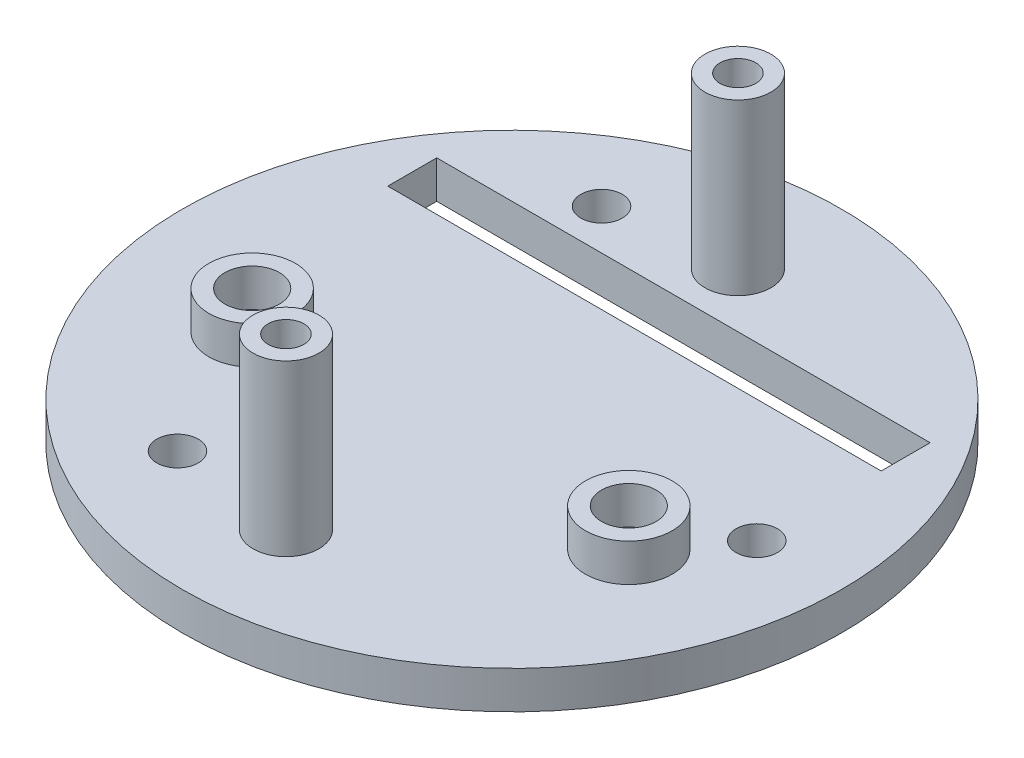
ISO-10303-21;
HEADER;
FILE_DESCRIPTION(('STEP AP214'),'2;1');
FILE_NAME('part.step','',(''),(''),'','','');
FILE_SCHEMA(('AUTOMOTIVE_DESIGN { 1 0 10303 214 1 1 1 1 }'));
ENDSEC;
DATA;
#1=APPLICATION_CONTEXT('core data for automotive mechanical design processes');
#2=APPLICATION_PROTOCOL_DEFINITION('international standard','automotive_design',2000,#1);
#3=PRODUCT_CONTEXT('',#1,'mechanical');
#4=PRODUCT('Part','Part','',(#3));
#5=PRODUCT_RELATED_PRODUCT_CATEGORY('part','',(#4));
#6=PRODUCT_DEFINITION_FORMATION('','',#4);
#7=PRODUCT_DEFINITION_CONTEXT('part definition',#1,'design');
#8=PRODUCT_DEFINITION('design','',#6,#7);
#9=PRODUCT_DEFINITION_SHAPE('','',#8);
#10=(LENGTH_UNIT() NAMED_UNIT(*) SI_UNIT(.MILLI.,.METRE.));
#11=(NAMED_UNIT(*) PLANE_ANGLE_UNIT() SI_UNIT($,.RADIAN.));
#12=(NAMED_UNIT(*) SI_UNIT($,.STERADIAN.) SOLID_ANGLE_UNIT());
#13=UNCERTAINTY_MEASURE_WITH_UNIT(LENGTH_MEASURE(1.E-05),#10,'distance_accuracy_value','');
#14=(GEOMETRIC_REPRESENTATION_CONTEXT(3) GLOBAL_UNCERTAINTY_ASSIGNED_CONTEXT((#13)) GLOBAL_UNIT_ASSIGNED_CONTEXT((#10,
#11,#12)) REPRESENTATION_CONTEXT('',''));
#15=CARTESIAN_POINT('',(0.,0.,0.));
#16=DIRECTION('',(0.,0.,1.));
#17=DIRECTION('',(1.,0.,0.));
#18=AXIS2_PLACEMENT_3D('',#15,#16,#17);
#19=CARTESIAN_POINT('',(-4.53168276531319E-07,2.,7.65631873007925E-07));
#20=DIRECTION('',(0.,1.,0.));
#21=DIRECTION('',(0.,0.,1.));
#22=AXIS2_PLACEMENT_3D('',#19,#20,#21);
#23=PLANE('',#22);
#24=CARTESIAN_POINT('',(0.,2.,-12.));
#25=DIRECTION('',(0.,1.,0.));
#26=DIRECTION('',(0.,0.,1.));
#27=AXIS2_PLACEMENT_3D('',#24,#25,#26);
#28=CIRCLE('',#27,1.75);
#29=CARTESIAN_POINT('',(0.,2.,-10.25));
#30=VERTEX_POINT('',#29);
#31=EDGE_CURVE('E174',#30,#30,#28,.F.);
#32=ORIENTED_EDGE('',*,*,#31,.T.);
#33=EDGE_LOOP('',(#32));
#34=FACE_BOUND('',#33,.T.);
#35=CARTESIAN_POINT('',(0.00199999999988129,2.,12.));
#36=DIRECTION('',(0.,1.,0.));
#37=DIRECTION('',(0.,0.,1.));
#38=AXIS2_PLACEMENT_3D('',#35,#36,#37);
#39=CIRCLE('',#38,1.75);
#40=CARTESIAN_POINT('',(0.00199999999988129,2.,13.75));
#41=VERTEX_POINT('',#40);
#42=EDGE_CURVE('E181',#41,#41,#39,.F.);
#43=ORIENTED_EDGE('',*,*,#42,.T.);
#44=EDGE_LOOP('',(#43));
#45=FACE_BOUND('',#44,.T.);
#46=CARTESIAN_POINT('',(-10.,2.,3.79325587671265));
#47=DIRECTION('',(0.,1.,0.));
#48=DIRECTION('',(0.,0.,1.));
#49=AXIS2_PLACEMENT_3D('',#46,#47,#48);
#50=CIRCLE('',#49,2.3);
#51=CARTESIAN_POINT('',(-10.,2.,6.09325587671264));
#52=VERTEX_POINT('',#51);
#53=EDGE_CURVE('E148',#52,#52,#50,.F.);
#54=ORIENTED_EDGE('',*,*,#53,.T.);
#55=EDGE_LOOP('',(#54));
#56=FACE_BOUND('',#55,.T.);
#57=CARTESIAN_POINT('',(10.,2.,3.79325587671264));
#58=DIRECTION('',(0.,1.,0.));
#59=DIRECTION('',(0.,0.,1.));
#60=AXIS2_PLACEMENT_3D('',#57,#58,#59);
#61=CIRCLE('',#60,2.3);
#62=CARTESIAN_POINT('',(10.,2.,6.09325587671264));
#63=VERTEX_POINT('',#62);
#64=EDGE_CURVE('E163',#63,#63,#61,.F.);
#65=ORIENTED_EDGE('',*,*,#64,.T.);
#66=EDGE_LOOP('',(#65));
#67=FACE_BOUND('',#66,.T.);
#68=CARTESIAN_POINT('',(13.,2.,-7.65631873005101E-07));
#69=DIRECTION('',(0.,1.,0.));
#70=DIRECTION('',(0.,0.,1.));
#71=AXIS2_PLACEMENT_3D('',#68,#69,#70);
#72=CIRCLE('',#71,1.1);
#73=CARTESIAN_POINT('',(13.,2.,1.09999923436813));
#74=VERTEX_POINT('',#73);
#75=EDGE_CURVE('E142',#74,#74,#72,.T.);
#76=ORIENTED_EDGE('',*,*,#75,.F.);
#77=EDGE_LOOP('',(#76));
#78=FACE_BOUND('',#77,.T.);
#79=DIRECTION('',(1.,0.,0.));
#80=VECTOR('',#79,1.);
#81=CARTESIAN_POINT('',(0.,2.,-6.50674412328736));
#82=LINE('',#81,#80);
#83=CARTESIAN_POINT('',(-13.1000004531683,2.,-6.50674412328736));
#84=VERTEX_POINT('',#83);
#85=CARTESIAN_POINT('',(13.0999995468317,2.,-6.50674412328736));
#86=VERTEX_POINT('',#85);
#87=EDGE_CURVE('E99',#84,#86,#82,.T.);
#88=ORIENTED_EDGE('',*,*,#87,.F.);
#89=DIRECTION('',(0.,0.,1.));
#90=VECTOR('',#89,1.);
#91=CARTESIAN_POINT('',(-13.1000004531683,2.,0.));
#92=LINE('',#91,#90);
#93=CARTESIAN_POINT('',(-13.1000004531683,2.,-9.10674412328736));
#94=VERTEX_POINT('',#93);
#95=EDGE_CURVE('E93',#94,#84,#92,.T.);
#96=ORIENTED_EDGE('',*,*,#95,.F.);
#97=DIRECTION('',(1.,0.,0.));
#98=VECTOR('',#97,1.);
#99=CARTESIAN_POINT('',(0.,2.,-9.10674412328736));
#100=LINE('',#99,#98);
#101=CARTESIAN_POINT('',(13.0999995468317,2.,-9.10674412328736));
#102=VERTEX_POINT('',#101);
#103=EDGE_CURVE('E83',#94,#102,#100,.T.);
#104=ORIENTED_EDGE('',*,*,#103,.T.);
#105=DIRECTION('',(0.,0.,-1.));
#106=VECTOR('',#105,1.);
#107=CARTESIAN_POINT('',(13.0999995468317,2.,0.));
#108=LINE('',#107,#106);
#109=EDGE_CURVE('E103',#86,#102,#108,.T.);
#110=ORIENTED_EDGE('',*,*,#109,.F.);
#111=EDGE_LOOP('',(#88,#96,#104,#110));
#112=FACE_BOUND('',#111,.T.);
#113=CARTESIAN_POINT('',(-4.53168276531319E-07,2.,7.65631873007925E-07));
#114=DIRECTION('',(0.,1.,0.));
#115=DIRECTION('',(0.,0.,1.));
#116=AXIS2_PLACEMENT_3D('',#113,#114,#115);
#117=CIRCLE('',#116,17.5);
#118=CARTESIAN_POINT('',(-4.53168276531319E-07,2.,17.5000007656319));
#119=VERTEX_POINT('',#118);
#120=EDGE_CURVE('E116',#119,#119,#117,.T.);
#121=ORIENTED_EDGE('',*,*,#120,.T.);
#122=EDGE_LOOP('',(#121));
#123=FACE_BOUND('',#122,.T.);
#124=CARTESIAN_POINT('',(-6.49999933694335,2.,11.2583306320136));
#125=DIRECTION('',(0.,1.,0.));
#126=DIRECTION('',(0.,0.,1.));
#127=AXIS2_PLACEMENT_3D('',#124,#125,#126);
#128=CIRCLE('',#127,1.1);
#129=CARTESIAN_POINT('',(-6.49999933694335,2.,12.3583306320136));
#130=VERTEX_POINT('',#129);
#131=EDGE_CURVE('E153',#130,#130,#128,.T.);
#132=ORIENTED_EDGE('',*,*,#131,.F.);
#133=EDGE_LOOP('',(#132));
#134=FACE_BOUND('',#133,.T.);
#135=CARTESIAN_POINT('',(-6.50000066305664,2.,-11.2583298663818));
#136=DIRECTION('',(0.,1.,0.));
#137=DIRECTION('',(0.,0.,1.));
#138=AXIS2_PLACEMENT_3D('',#135,#136,#137);
#139=CIRCLE('',#138,1.1);
#140=CARTESIAN_POINT('',(-6.50000066305664,2.,-10.1583298663818));
#141=VERTEX_POINT('',#140);
#142=EDGE_CURVE('E143',#141,#141,#139,.T.);
#143=ORIENTED_EDGE('',*,*,#142,.F.);
#144=EDGE_LOOP('',(#143));
#145=FACE_BOUND('',#144,.T.);
#146=ADVANCED_FACE('F41',(#34,#45,#56,#67,#78,#112,#123,#134,#145),#23,.T.);
#147=CARTESIAN_POINT('',(-4.53168276531319E-07,0.,7.65631873007925E-07));
#148=DIRECTION('',(0.,1.,0.));
#149=DIRECTION('',(0.,0.,1.));
#150=AXIS2_PLACEMENT_3D('',#147,#148,#149);
#151=PLANE('',#150);
#152=CARTESIAN_POINT('',(-4.53168276531319E-07,0.,7.65631873007925E-07));
#153=DIRECTION('',(0.,1.,0.));
#154=DIRECTION('',(0.,0.,1.));
#155=AXIS2_PLACEMENT_3D('',#152,#153,#154);
#156=CIRCLE('',#155,17.5);
#157=CARTESIAN_POINT('',(-4.53168276531319E-07,0.,17.5000007656319));
#158=VERTEX_POINT('',#157);
#159=EDGE_CURVE('E45',#158,#158,#156,.T.);
#160=ORIENTED_EDGE('',*,*,#159,.F.);
#161=EDGE_LOOP('',(#160));
#162=FACE_BOUND('',#161,.T.);
#163=DIRECTION('',(0.,0.,1.));
#164=VECTOR('',#163,1.);
#165=CARTESIAN_POINT('',(-13.1000004531683,0.,0.));
#166=LINE('',#165,#164);
#167=CARTESIAN_POINT('',(-13.1000004531683,0.,-9.10674412328736));
#168=VERTEX_POINT('',#167);
#169=CARTESIAN_POINT('',(-13.1000004531683,0.,-6.50674412328736));
#170=VERTEX_POINT('',#169);
#171=EDGE_CURVE('E66',#168,#170,#166,.T.);
#172=ORIENTED_EDGE('',*,*,#171,.T.);
#173=DIRECTION('',(1.,0.,0.));
#174=VECTOR('',#173,1.);
#175=CARTESIAN_POINT('',(0.,0.,-6.50674412328736));
#176=LINE('',#175,#174);
#177=CARTESIAN_POINT('',(13.0999995468317,0.,-6.50674412328736));
#178=VERTEX_POINT('',#177);
#179=EDGE_CURVE('E101',#170,#178,#176,.T.);
#180=ORIENTED_EDGE('',*,*,#179,.T.);
#181=DIRECTION('',(0.,0.,-1.));
#182=VECTOR('',#181,1.);
#183=CARTESIAN_POINT('',(13.0999995468317,0.,0.));
#184=LINE('',#183,#182);
#185=CARTESIAN_POINT('',(13.0999995468317,0.,-9.10674412328736));
#186=VERTEX_POINT('',#185);
#187=EDGE_CURVE('E109',#178,#186,#184,.T.);
#188=ORIENTED_EDGE('',*,*,#187,.T.);
#189=DIRECTION('',(1.,0.,0.));
#190=VECTOR('',#189,1.);
#191=CARTESIAN_POINT('',(0.,0.,-9.10674412328736));
#192=LINE('',#191,#190);
#193=EDGE_CURVE('E95',#168,#186,#192,.T.);
#194=ORIENTED_EDGE('',*,*,#193,.F.);
#195=EDGE_LOOP('',(#172,#180,#188,#194));
#196=FACE_BOUND('',#195,.T.);
#197=CARTESIAN_POINT('',(-6.49999933694335,0.,11.2583306320136));
#198=DIRECTION('',(0.,1.,0.));
#199=DIRECTION('',(0.,0.,1.));
#200=AXIS2_PLACEMENT_3D('',#197,#198,#199);
#201=CIRCLE('',#200,1.1);
#202=CARTESIAN_POINT('',(-6.49999933694335,0.,12.3583306320136));
#203=VERTEX_POINT('',#202);
#204=EDGE_CURVE('E133',#203,#203,#201,.T.);
#205=ORIENTED_EDGE('',*,*,#204,.T.);
#206=EDGE_LOOP('',(#205));
#207=FACE_BOUND('',#206,.T.);
#208=CARTESIAN_POINT('',(13.,0.,-7.65631873005101E-07));
#209=DIRECTION('',(0.,1.,0.));
#210=DIRECTION('',(0.,0.,1.));
#211=AXIS2_PLACEMENT_3D('',#208,#209,#210);
#212=CIRCLE('',#211,1.1);
#213=CARTESIAN_POINT('',(13.,0.,1.09999923436813));
#214=VERTEX_POINT('',#213);
#215=EDGE_CURVE('E137',#214,#214,#212,.T.);
#216=ORIENTED_EDGE('',*,*,#215,.T.);
#217=EDGE_LOOP('',(#216));
#218=FACE_BOUND('',#217,.T.);
#219=CARTESIAN_POINT('',(-6.50000066305664,0.,-11.2583298663818));
#220=DIRECTION('',(0.,1.,0.));
#221=DIRECTION('',(0.,0.,1.));
#222=AXIS2_PLACEMENT_3D('',#219,#220,#221);
#223=CIRCLE('',#222,1.1);
#224=CARTESIAN_POINT('',(-6.50000066305664,0.,-10.1583298663818));
#225=VERTEX_POINT('',#224);
#226=EDGE_CURVE('E140',#225,#225,#223,.T.);
#227=ORIENTED_EDGE('',*,*,#226,.T.);
#228=EDGE_LOOP('',(#227));
#229=FACE_BOUND('',#228,.T.);
#230=ADVANCED_FACE('F126',(#162,#196,#207,#218,#229),#151,.F.);
#231=CARTESIAN_POINT('',(-4.53168276531319E-07,2.,7.65631873007925E-07));
#232=DIRECTION('',(0.,-1.,0.));
#233=DIRECTION('',(0.,0.,-1.));
#234=AXIS2_PLACEMENT_3D('',#231,#232,#233);
#235=CYLINDRICAL_SURFACE('',#234,17.5);
#236=ORIENTED_EDGE('',*,*,#120,.F.);
#237=EDGE_LOOP('',(#236));
#238=FACE_BOUND('',#237,.T.);
#239=ORIENTED_EDGE('',*,*,#159,.T.);
#240=EDGE_LOOP('',(#239));
#241=FACE_BOUND('',#240,.T.);
#242=ADVANCED_FACE('F43',(#238,#241),#235,.T.);
#243=CARTESIAN_POINT('',(-13.1000004531683,2.001,0.));
#244=DIRECTION('',(1.,0.,0.));
#245=DIRECTION('',(0.,0.,-1.));
#246=AXIS2_PLACEMENT_3D('',#243,#244,#245);
#247=PLANE('',#246);
#248=ORIENTED_EDGE('',*,*,#95,.T.);
#249=DIRECTION('',(0.,-1.,0.));
#250=VECTOR('',#249,1.);
#251=CARTESIAN_POINT('',(-13.1000004531683,2.001,-6.50674412328736));
#252=LINE('',#251,#250);
#253=EDGE_CURVE('E90',#84,#170,#252,.T.);
#254=ORIENTED_EDGE('',*,*,#253,.T.);
#255=ORIENTED_EDGE('',*,*,#171,.F.);
#256=DIRECTION('',(0.,-1.,0.));
#257=VECTOR('',#256,1.);
#258=CARTESIAN_POINT('',(-13.1000004531683,2.001,-9.10674412328736));
#259=LINE('',#258,#257);
#260=EDGE_CURVE('E85',#94,#168,#259,.T.);
#261=ORIENTED_EDGE('',*,*,#260,.F.);
#262=EDGE_LOOP('',(#248,#254,#255,#261));
#263=FACE_BOUND('',#262,.T.);
#264=ADVANCED_FACE('F92',(#263),#247,.T.);
#265=CARTESIAN_POINT('',(0.,2.001,-6.50674412328736));
#266=DIRECTION('',(0.,0.,-1.));
#267=DIRECTION('',(-1.,0.,0.));
#268=AXIS2_PLACEMENT_3D('',#265,#266,#267);
#269=PLANE('',#268);
#270=ORIENTED_EDGE('',*,*,#87,.T.);
#271=DIRECTION('',(0.,-1.,0.));
#272=VECTOR('',#271,1.);
#273=CARTESIAN_POINT('',(13.0999995468317,2.001,-6.50674412328736));
#274=LINE('',#273,#272);
#275=EDGE_CURVE('E114',#86,#178,#274,.T.);
#276=ORIENTED_EDGE('',*,*,#275,.T.);
#277=ORIENTED_EDGE('',*,*,#179,.F.);
#278=ORIENTED_EDGE('',*,*,#253,.F.);
#279=EDGE_LOOP('',(#270,#276,#277,#278));
#280=FACE_BOUND('',#279,.T.);
#281=ADVANCED_FACE('F306',(#280),#269,.T.);
#282=CARTESIAN_POINT('',(13.0999995468317,2.001,0.));
#283=DIRECTION('',(-1.,0.,0.));
#284=DIRECTION('',(0.,0.,1.));
#285=AXIS2_PLACEMENT_3D('',#282,#283,#284);
#286=PLANE('',#285);
#287=ORIENTED_EDGE('',*,*,#109,.T.);
#288=DIRECTION('',(0.,-1.,0.));
#289=VECTOR('',#288,1.);
#290=CARTESIAN_POINT('',(13.0999995468317,2.001,-9.10674412328736));
#291=LINE('',#290,#289);
#292=EDGE_CURVE('E58',#102,#186,#291,.T.);
#293=ORIENTED_EDGE('',*,*,#292,.T.);
#294=ORIENTED_EDGE('',*,*,#187,.F.);
#295=ORIENTED_EDGE('',*,*,#275,.F.);
#296=EDGE_LOOP('',(#287,#293,#294,#295));
#297=FACE_BOUND('',#296,.T.);
#298=ADVANCED_FACE('F303',(#297),#286,.T.);
#299=CARTESIAN_POINT('',(0.,2.001,-9.10674412328736));
#300=DIRECTION('',(0.,0.,-1.));
#301=DIRECTION('',(-1.,0.,0.));
#302=AXIS2_PLACEMENT_3D('',#299,#300,#301);
#303=PLANE('',#302);
#304=ORIENTED_EDGE('',*,*,#260,.T.);
#305=ORIENTED_EDGE('',*,*,#193,.T.);
#306=ORIENTED_EDGE('',*,*,#292,.F.);
#307=ORIENTED_EDGE('',*,*,#103,.F.);
#308=EDGE_LOOP('',(#304,#305,#306,#307));
#309=FACE_BOUND('',#308,.T.);
#310=ADVANCED_FACE('F84',(#309),#303,.F.);
#311=CARTESIAN_POINT('',(-6.49999933694335,2.001,11.2583306320136));
#312=DIRECTION('',(0.,-1.,0.));
#313=DIRECTION('',(0.,0.,-1.));
#314=AXIS2_PLACEMENT_3D('',#311,#312,#313);
#315=CYLINDRICAL_SURFACE('',#314,1.1);
#316=ORIENTED_EDGE('',*,*,#131,.T.);
#317=EDGE_LOOP('',(#316));
#318=FACE_BOUND('',#317,.T.);
#319=ORIENTED_EDGE('',*,*,#204,.F.);
#320=EDGE_LOOP('',(#319));
#321=FACE_BOUND('',#320,.T.);
#322=ADVANCED_FACE('F290',(#318,#321),#315,.F.);
#323=CARTESIAN_POINT('',(13.,2.001,-7.65631873005101E-07));
#324=DIRECTION('',(0.,-1.,0.));
#325=DIRECTION('',(0.,0.,-1.));
#326=AXIS2_PLACEMENT_3D('',#323,#324,#325);
#327=CYLINDRICAL_SURFACE('',#326,1.1);
#328=ORIENTED_EDGE('',*,*,#75,.T.);
#329=EDGE_LOOP('',(#328));
#330=FACE_BOUND('',#329,.T.);
#331=ORIENTED_EDGE('',*,*,#215,.F.);
#332=EDGE_LOOP('',(#331));
#333=FACE_BOUND('',#332,.T.);
#334=ADVANCED_FACE('F293',(#330,#333),#327,.F.);
#335=CARTESIAN_POINT('',(-6.50000066305664,2.001,-11.2583298663818));
#336=DIRECTION('',(0.,-1.,0.));
#337=DIRECTION('',(0.,0.,-1.));
#338=AXIS2_PLACEMENT_3D('',#335,#336,#337);
#339=CYLINDRICAL_SURFACE('',#338,1.1);
#340=ORIENTED_EDGE('',*,*,#142,.T.);
#341=EDGE_LOOP('',(#340));
#342=FACE_BOUND('',#341,.T.);
#343=ORIENTED_EDGE('',*,*,#226,.F.);
#344=EDGE_LOOP('',(#343));
#345=FACE_BOUND('',#344,.T.);
#346=ADVANCED_FACE('F288',(#342,#345),#339,.F.);
#347=CARTESIAN_POINT('',(10.,4.,3.79325587671264));
#348=DIRECTION('',(0.,-1.,0.));
#349=DIRECTION('',(0.,0.,-1.));
#350=AXIS2_PLACEMENT_3D('',#347,#348,#349);
#351=CYLINDRICAL_SURFACE('',#350,1.45);
#352=CARTESIAN_POINT('',(10.,2.,3.79325587671264));
#353=DIRECTION('',(0.,1.,0.));
#354=DIRECTION('',(0.,0.,1.));
#355=AXIS2_PLACEMENT_3D('',#352,#353,#354);
#356=CIRCLE('',#355,1.45);
#357=CARTESIAN_POINT('',(10.,2.,5.24325587671264));
#358=VERTEX_POINT('',#357);
#359=EDGE_CURVE('E160',#358,#358,#356,.T.);
#360=ORIENTED_EDGE('',*,*,#359,.F.);
#361=EDGE_LOOP('',(#360));
#362=FACE_BOUND('',#361,.T.);
#363=CARTESIAN_POINT('',(10.,4.,3.79325587671264));
#364=DIRECTION('',(0.,1.,0.));
#365=DIRECTION('',(0.,0.,1.));
#366=AXIS2_PLACEMENT_3D('',#363,#364,#365);
#367=CIRCLE('',#366,1.45);
#368=CARTESIAN_POINT('',(10.,4.,5.24325587671264));
#369=VERTEX_POINT('',#368);
#370=EDGE_CURVE('E171',#369,#369,#367,.F.);
#371=ORIENTED_EDGE('',*,*,#370,.F.);
#372=EDGE_LOOP('',(#371));
#373=FACE_BOUND('',#372,.T.);
#374=ADVANCED_FACE('F284',(#362,#373),#351,.F.);
#375=CARTESIAN_POINT('',(10.,4.,3.79325587671264));
#376=DIRECTION('',(0.,-1.,0.));
#377=DIRECTION('',(0.,0.,-1.));
#378=AXIS2_PLACEMENT_3D('',#375,#376,#377);
#379=CYLINDRICAL_SURFACE('',#378,2.3);
#380=ORIENTED_EDGE('',*,*,#64,.F.);
#381=EDGE_LOOP('',(#380));
#382=FACE_BOUND('',#381,.T.);
#383=CARTESIAN_POINT('',(10.,4.,3.79325587671264));
#384=DIRECTION('',(0.,1.,0.));
#385=DIRECTION('',(0.,0.,1.));
#386=AXIS2_PLACEMENT_3D('',#383,#384,#385);
#387=CIRCLE('',#386,2.3);
#388=CARTESIAN_POINT('',(10.,4.,6.09325587671264));
#389=VERTEX_POINT('',#388);
#390=EDGE_CURVE('E167',#389,#389,#387,.T.);
#391=ORIENTED_EDGE('',*,*,#390,.F.);
#392=EDGE_LOOP('',(#391));
#393=FACE_BOUND('',#392,.T.);
#394=ADVANCED_FACE('F242',(#382,#393),#379,.T.);
#395=CARTESIAN_POINT('',(0.,4.,0.));
#396=DIRECTION('',(0.,1.,0.));
#397=DIRECTION('',(0.,0.,1.));
#398=AXIS2_PLACEMENT_3D('',#395,#396,#397);
#399=PLANE('',#398);
#400=ORIENTED_EDGE('',*,*,#370,.T.);
#401=EDGE_LOOP('',(#400));
#402=FACE_BOUND('',#401,.T.);
#403=ORIENTED_EDGE('',*,*,#390,.T.);
#404=EDGE_LOOP('',(#403));
#405=FACE_BOUND('',#404,.T.);
#406=ADVANCED_FACE('F232',(#402,#405),#399,.T.);
#407=ORIENTED_EDGE('',*,*,#359,.T.);
#408=EDGE_LOOP('',(#407));
#409=FACE_BOUND('',#408,.T.);
#410=ADVANCED_FACE('F222',(#409),#23,.T.);
#411=CARTESIAN_POINT('',(-10.,4.,3.79325587671265));
#412=DIRECTION('',(0.,-1.,0.));
#413=DIRECTION('',(0.,0.,-1.));
#414=AXIS2_PLACEMENT_3D('',#411,#412,#413);
#415=CYLINDRICAL_SURFACE('',#414,1.45);
#416=CARTESIAN_POINT('',(-10.,2.,3.79325587671265));
#417=DIRECTION('',(0.,1.,0.));
#418=DIRECTION('',(0.,0.,1.));
#419=AXIS2_PLACEMENT_3D('',#416,#417,#418);
#420=CIRCLE('',#419,1.45);
#421=CARTESIAN_POINT('',(-10.,2.,5.24325587671265));
#422=VERTEX_POINT('',#421);
#423=EDGE_CURVE('E118',#422,#422,#420,.F.);
#424=ORIENTED_EDGE('',*,*,#423,.T.);
#425=EDGE_LOOP('',(#424));
#426=FACE_BOUND('',#425,.T.);
#427=CARTESIAN_POINT('',(-10.,4.,3.79325587671265));
#428=DIRECTION('',(0.,1.,0.));
#429=DIRECTION('',(0.,0.,1.));
#430=AXIS2_PLACEMENT_3D('',#427,#428,#429);
#431=CIRCLE('',#430,1.45);
#432=CARTESIAN_POINT('',(-10.,4.,5.24325587671265));
#433=VERTEX_POINT('',#432);
#434=EDGE_CURVE('E170',#433,#433,#431,.T.);
#435=ORIENTED_EDGE('',*,*,#434,.T.);
#436=EDGE_LOOP('',(#435));
#437=FACE_BOUND('',#436,.T.);
#438=ADVANCED_FACE('F231',(#426,#437),#415,.F.);
#439=CARTESIAN_POINT('',(-10.,4.,3.79325587671265));
#440=DIRECTION('',(0.,-1.,0.));
#441=DIRECTION('',(0.,0.,-1.));
#442=AXIS2_PLACEMENT_3D('',#439,#440,#441);
#443=CYLINDRICAL_SURFACE('',#442,2.3);
#444=ORIENTED_EDGE('',*,*,#53,.F.);
#445=EDGE_LOOP('',(#444));
#446=FACE_BOUND('',#445,.T.);
#447=CARTESIAN_POINT('',(-10.,4.,3.79325587671265));
#448=DIRECTION('',(0.,1.,0.));
#449=DIRECTION('',(0.,0.,1.));
#450=AXIS2_PLACEMENT_3D('',#447,#448,#449);
#451=CIRCLE('',#450,2.3);
#452=CARTESIAN_POINT('',(-10.,4.,6.09325587671264));
#453=VERTEX_POINT('',#452);
#454=EDGE_CURVE('E166',#453,#453,#451,.T.);
#455=ORIENTED_EDGE('',*,*,#454,.F.);
#456=EDGE_LOOP('',(#455));
#457=FACE_BOUND('',#456,.T.);
#458=ADVANCED_FACE('F239',(#446,#457),#443,.T.);
#459=CARTESIAN_POINT('',(0.,4.,0.));
#460=DIRECTION('',(0.,1.,0.));
#461=DIRECTION('',(0.,0.,1.));
#462=AXIS2_PLACEMENT_3D('',#459,#460,#461);
#463=PLANE('',#462);
#464=ORIENTED_EDGE('',*,*,#434,.F.);
#465=EDGE_LOOP('',(#464));
#466=FACE_BOUND('',#465,.T.);
#467=ORIENTED_EDGE('',*,*,#454,.T.);
#468=EDGE_LOOP('',(#467));
#469=FACE_BOUND('',#468,.T.);
#470=ADVANCED_FACE('F246',(#466,#469),#463,.T.);
#471=ORIENTED_EDGE('',*,*,#423,.F.);
#472=EDGE_LOOP('',(#471));
#473=FACE_BOUND('',#472,.T.);
#474=ADVANCED_FACE('F234',(#473),#23,.T.);
#475=CARTESIAN_POINT('',(0.00199999999988129,11.,12.));
#476=DIRECTION('',(0.,-1.,0.));
#477=DIRECTION('',(0.,0.,-1.));
#478=AXIS2_PLACEMENT_3D('',#475,#476,#477);
#479=CYLINDRICAL_SURFACE('',#478,0.95);
#480=CARTESIAN_POINT('',(0.00199999999988129,2.,12.));
#481=DIRECTION('',(0.,1.,0.));
#482=DIRECTION('',(0.,0.,1.));
#483=AXIS2_PLACEMENT_3D('',#480,#481,#482);
#484=CIRCLE('',#483,0.95);
#485=CARTESIAN_POINT('',(0.00199999999988129,2.,12.95));
#486=VERTEX_POINT('',#485);
#487=EDGE_CURVE('E50',#486,#486,#484,.F.);
#488=ORIENTED_EDGE('',*,*,#487,.T.);
#489=EDGE_LOOP('',(#488));
#490=FACE_BOUND('',#489,.T.);
#491=CARTESIAN_POINT('',(0.00199999999988129,11.,12.));
#492=DIRECTION('',(0.,1.,0.));
#493=DIRECTION('',(0.,0.,1.));
#494=AXIS2_PLACEMENT_3D('',#491,#492,#493);
#495=CIRCLE('',#494,0.95);
#496=CARTESIAN_POINT('',(0.00199999999988129,11.,12.95));
#497=VERTEX_POINT('',#496);
#498=EDGE_CURVE('E191',#497,#497,#495,.T.);
#499=ORIENTED_EDGE('',*,*,#498,.T.);
#500=EDGE_LOOP('',(#499));
#501=FACE_BOUND('',#500,.T.);
#502=ADVANCED_FACE('F245',(#490,#501),#479,.F.);
#503=CARTESIAN_POINT('',(0.00199999999988129,11.,12.));
#504=DIRECTION('',(0.,-1.,0.));
#505=DIRECTION('',(0.,0.,-1.));
#506=AXIS2_PLACEMENT_3D('',#503,#504,#505);
#507=CYLINDRICAL_SURFACE('',#506,1.75);
#508=ORIENTED_EDGE('',*,*,#42,.F.);
#509=EDGE_LOOP('',(#508));
#510=FACE_BOUND('',#509,.T.);
#511=CARTESIAN_POINT('',(0.00199999999988129,11.,12.));
#512=DIRECTION('',(0.,1.,0.));
#513=DIRECTION('',(0.,0.,1.));
#514=AXIS2_PLACEMENT_3D('',#511,#512,#513);
#515=CIRCLE('',#514,1.75);
#516=CARTESIAN_POINT('',(0.00199999999988129,11.,13.75));
#517=VERTEX_POINT('',#516);
#518=EDGE_CURVE('E187',#517,#517,#515,.T.);
#519=ORIENTED_EDGE('',*,*,#518,.F.);
#520=EDGE_LOOP('',(#519));
#521=FACE_BOUND('',#520,.T.);
#522=ADVANCED_FACE('F252',(#510,#521),#507,.T.);
#523=CARTESIAN_POINT('',(0.,11.,0.));
#524=DIRECTION('',(0.,1.,0.));
#525=DIRECTION('',(0.,0.,1.));
#526=AXIS2_PLACEMENT_3D('',#523,#524,#525);
#527=PLANE('',#526);
#528=ORIENTED_EDGE('',*,*,#498,.F.);
#529=EDGE_LOOP('',(#528));
#530=FACE_BOUND('',#529,.T.);
#531=ORIENTED_EDGE('',*,*,#518,.T.);
#532=EDGE_LOOP('',(#531));
#533=FACE_BOUND('',#532,.T.);
#534=ADVANCED_FACE('F259',(#530,#533),#527,.T.);
#535=ORIENTED_EDGE('',*,*,#487,.F.);
#536=EDGE_LOOP('',(#535));
#537=FACE_BOUND('',#536,.T.);
#538=ADVANCED_FACE('F215',(#537),#23,.T.);
#539=CARTESIAN_POINT('',(0.,11.,-12.));
#540=DIRECTION('',(0.,-1.,0.));
#541=DIRECTION('',(0.,0.,-1.));
#542=AXIS2_PLACEMENT_3D('',#539,#540,#541);
#543=CYLINDRICAL_SURFACE('',#542,0.95);
#544=CARTESIAN_POINT('',(0.,2.,-12.));
#545=DIRECTION('',(0.,1.,0.));
#546=DIRECTION('',(0.,0.,1.));
#547=AXIS2_PLACEMENT_3D('',#544,#545,#546);
#548=CIRCLE('',#547,0.95);
#549=CARTESIAN_POINT('',(0.,2.,-11.05));
#550=VERTEX_POINT('',#549);
#551=EDGE_CURVE('E11',#550,#550,#548,.F.);
#552=ORIENTED_EDGE('',*,*,#551,.T.);
#553=EDGE_LOOP('',(#552));
#554=FACE_BOUND('',#553,.T.);
#555=CARTESIAN_POINT('',(0.,11.,-12.));
#556=DIRECTION('',(0.,1.,0.));
#557=DIRECTION('',(0.,0.,1.));
#558=AXIS2_PLACEMENT_3D('',#555,#556,#557);
#559=CIRCLE('',#558,0.95);
#560=CARTESIAN_POINT('',(0.,11.,-11.05));
#561=VERTEX_POINT('',#560);
#562=EDGE_CURVE('E190',#561,#561,#559,.T.);
#563=ORIENTED_EDGE('',*,*,#562,.T.);
#564=EDGE_LOOP('',(#563));
#565=FACE_BOUND('',#564,.T.);
#566=ADVANCED_FACE('F199',(#554,#565),#543,.F.);
#567=CARTESIAN_POINT('',(0.,11.,-12.));
#568=DIRECTION('',(0.,-1.,0.));
#569=DIRECTION('',(0.,0.,-1.));
#570=AXIS2_PLACEMENT_3D('',#567,#568,#569);
#571=CYLINDRICAL_SURFACE('',#570,1.75);
#572=ORIENTED_EDGE('',*,*,#31,.F.);
#573=EDGE_LOOP('',(#572));
#574=FACE_BOUND('',#573,.T.);
#575=CARTESIAN_POINT('',(0.,11.,-12.));
#576=DIRECTION('',(0.,1.,0.));
#577=DIRECTION('',(0.,0.,1.));
#578=AXIS2_PLACEMENT_3D('',#575,#576,#577);
#579=CIRCLE('',#578,1.75);
#580=CARTESIAN_POINT('',(0.,11.,-10.25));
#581=VERTEX_POINT('',#580);
#582=EDGE_CURVE('E186',#581,#581,#579,.T.);
#583=ORIENTED_EDGE('',*,*,#582,.F.);
#584=EDGE_LOOP('',(#583));
#585=FACE_BOUND('',#584,.T.);
#586=ADVANCED_FACE('F205',(#574,#585),#571,.T.);
#587=CARTESIAN_POINT('',(0.,11.,0.));
#588=DIRECTION('',(0.,1.,0.));
#589=DIRECTION('',(0.,0.,1.));
#590=AXIS2_PLACEMENT_3D('',#587,#588,#589);
#591=PLANE('',#590);
#592=ORIENTED_EDGE('',*,*,#562,.F.);
#593=EDGE_LOOP('',(#592));
#594=FACE_BOUND('',#593,.T.);
#595=ORIENTED_EDGE('',*,*,#582,.T.);
#596=EDGE_LOOP('',(#595));
#597=FACE_BOUND('',#596,.T.);
#598=ADVANCED_FACE('F201',(#594,#597),#591,.T.);
#599=ORIENTED_EDGE('',*,*,#551,.F.);
#600=EDGE_LOOP('',(#599));
#601=FACE_BOUND('',#600,.T.);
#602=ADVANCED_FACE('F204',(#601),#23,.T.);
#603=CLOSED_SHELL('',(#146,#230,#242,#264,#281,#298,#310,#322,#334,#346,#374,#394,#406,#410,
#438,#458,#470,#474,#502,#522,#534,#538,#566,#586,#598,#602));
#604=MANIFOLD_SOLID_BREP('B2',#603);
#605=ADVANCED_BREP_SHAPE_REPRESENTATION('',(#18,#604),#14);
#606=SHAPE_DEFINITION_REPRESENTATION(#9,#605);
ENDSEC;
END-ISO-10303-21;
